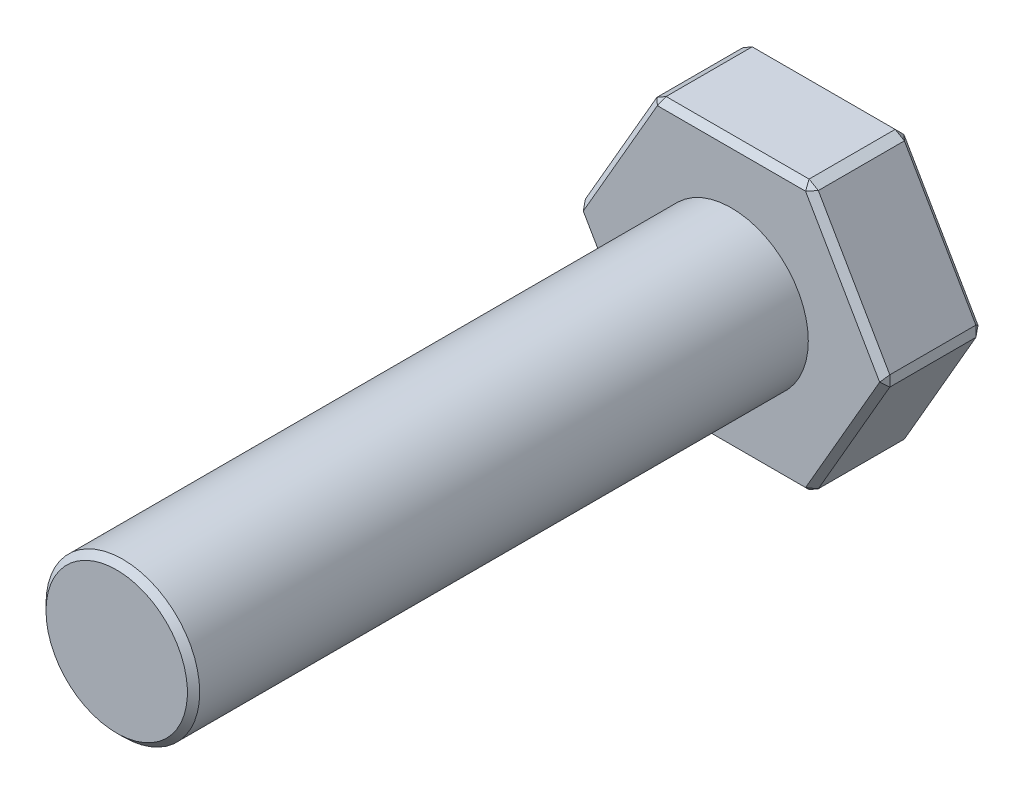
ISO-10303-21;
HEADER;
FILE_DESCRIPTION(('STEP AP214'),'2;1');
FILE_NAME('part.step','',(''),(''),'','','');
FILE_SCHEMA(('AUTOMOTIVE_DESIGN { 1 0 10303 214 1 1 1 1 }'));
ENDSEC;
DATA;
#1=APPLICATION_CONTEXT('core data for automotive mechanical design processes');
#2=APPLICATION_PROTOCOL_DEFINITION('international standard','automotive_design',2000,#1);
#3=PRODUCT_CONTEXT('',#1,'mechanical');
#4=PRODUCT('Part','Part','',(#3));
#5=PRODUCT_RELATED_PRODUCT_CATEGORY('part','',(#4));
#6=PRODUCT_DEFINITION_FORMATION('','',#4);
#7=PRODUCT_DEFINITION_CONTEXT('part definition',#1,'design');
#8=PRODUCT_DEFINITION('design','',#6,#7);
#9=PRODUCT_DEFINITION_SHAPE('','',#8);
#10=(LENGTH_UNIT() NAMED_UNIT(*) SI_UNIT(.MILLI.,.METRE.));
#11=(NAMED_UNIT(*) PLANE_ANGLE_UNIT() SI_UNIT($,.RADIAN.));
#12=(NAMED_UNIT(*) SI_UNIT($,.STERADIAN.) SOLID_ANGLE_UNIT());
#13=UNCERTAINTY_MEASURE_WITH_UNIT(LENGTH_MEASURE(1.E-05),#10,'distance_accuracy_value','');
#14=(GEOMETRIC_REPRESENTATION_CONTEXT(3) GLOBAL_UNCERTAINTY_ASSIGNED_CONTEXT((#13)) GLOBAL_UNIT_ASSIGNED_CONTEXT((#10,
#11,#12)) REPRESENTATION_CONTEXT('',''));
#15=CARTESIAN_POINT('',(0.,0.,0.));
#16=DIRECTION('',(0.,0.,1.));
#17=DIRECTION('',(1.,0.,0.));
#18=AXIS2_PLACEMENT_3D('',#15,#16,#17);
#19=CARTESIAN_POINT('',(-3.33490243318485,-5.33627954743875,0.254));
#20=DIRECTION('',(-0.418321028566615,-0.724553275351851,-0.547750005235851));
#21=DIRECTION('',(0.,0.603050160746813,-0.797703267903073));
#22=AXIS2_PLACEMENT_3D('',#19,#20,#21);
#23=PLANE('',#22);
#24=DIRECTION('',(0.729902592366238,0.0907675134870601,-0.677497944020808));
#25=VECTOR('',#24,1.);
#26=CARTESIAN_POINT('',(-3.33490243318485,-5.33627954743875,0.254000000000003));
#27=LINE('',#26,#25);
#28=CARTESIAN_POINT('',(-3.33490243318485,-5.33627954743875,0.254));
#29=VERTEX_POINT('',#28);
#30=CARTESIAN_POINT('',(-3.06125546481069,-5.30225,0.));
#31=VERTEX_POINT('',#30);
#32=EDGE_CURVE('E173',#29,#31,#27,.T.);
#33=ORIENTED_EDGE('',*,*,#32,.T.);
#34=DIRECTION('',(0.286344323664989,-0.677497944020808,0.677497944020805));
#35=VECTOR('',#34,1.);
#36=CARTESIAN_POINT('',(-3.06125546481069,-5.30225,0.));
#37=LINE('',#36,#35);
#38=CARTESIAN_POINT('',(-2.95390243318485,-5.55625,0.254));
#39=VERTEX_POINT('',#38);
#40=EDGE_CURVE('E171',#31,#39,#37,.T.);
#41=ORIENTED_EDGE('',*,*,#40,.T.);
#42=DIRECTION('',(-0.866025403784439,0.5,0.));
#43=VECTOR('',#42,1.);
#44=CARTESIAN_POINT('',(-2.95390243318485,-5.55625,0.253999999999998));
#45=LINE('',#44,#43);
#46=EDGE_CURVE('E184',#39,#29,#45,.T.);
#47=ORIENTED_EDGE('',*,*,#46,.T.);
#48=EDGE_LOOP('',(#33,#41,#47));
#49=FACE_BOUND('',#48,.T.);
#50=ADVANCED_FACE('F16',(#49),#23,.T.);
#51=CARTESIAN_POINT('',(-6.28880486636971,0.219970452561246,0.254000000000001));
#52=DIRECTION('',(-0.836642057133233,0.,-0.547750005235848));
#53=DIRECTION('',(-0.547750005235848,0.,0.836642057133233));
#54=AXIS2_PLACEMENT_3D('',#51,#52,#53);
#55=PLANE('',#54);
#56=DIRECTION('',(-0.443558268701259,-0.58673043053375,0.677497944020809));
#57=VECTOR('',#56,1.);
#58=CARTESIAN_POINT('',(-6.12251092962138,0.,0.));
#59=LINE('',#58,#57);
#60=CARTESIAN_POINT('',(-6.12251092962138,0.,0.));
#61=VERTEX_POINT('',#60);
#62=CARTESIAN_POINT('',(-6.28880486636971,-0.21997045256125,0.254));
#63=VERTEX_POINT('',#62);
#64=EDGE_CURVE('E180',#61,#63,#59,.T.);
#65=ORIENTED_EDGE('',*,*,#64,.T.);
#66=DIRECTION('',(0.,1.,0.));
#67=VECTOR('',#66,1.);
#68=CARTESIAN_POINT('',(-6.28880486636971,-0.21997045256125,0.254));
#69=LINE('',#68,#67);
#70=CARTESIAN_POINT('',(-6.28880486636971,0.219970452561246,0.254000000000001));
#71=VERTEX_POINT('',#70);
#72=EDGE_CURVE('E193',#63,#71,#69,.T.);
#73=ORIENTED_EDGE('',*,*,#72,.T.);
#74=DIRECTION('',(0.44355826870126,-0.586730430533748,-0.677497944020809));
#75=VECTOR('',#74,1.);
#76=CARTESIAN_POINT('',(-6.28880486636971,0.219970452561245,0.254000000000002));
#77=LINE('',#76,#75);
#78=EDGE_CURVE('E190',#71,#61,#77,.T.);
#79=ORIENTED_EDGE('',*,*,#78,.T.);
#80=EDGE_LOOP('',(#65,#73,#79));
#81=FACE_BOUND('',#80,.T.);
#82=ADVANCED_FACE('F514',(#81),#55,.T.);
#83=CARTESIAN_POINT('',(-2.95390243318485,5.55625,0.254));
#84=DIRECTION('',(-0.418321028566617,0.724553275351849,-0.547750005235851));
#85=DIRECTION('',(0.,0.603050160746814,0.797703267903073));
#86=AXIS2_PLACEMENT_3D('',#83,#84,#85);
#87=PLANE('',#86);
#88=DIRECTION('',(-0.729902592366236,0.0907675134870601,0.67749794402081));
#89=VECTOR('',#88,1.);
#90=CARTESIAN_POINT('',(-3.06125546481069,5.30225,0.));
#91=LINE('',#90,#89);
#92=CARTESIAN_POINT('',(-3.06125546481069,5.30225,0.));
#93=VERTEX_POINT('',#92);
#94=CARTESIAN_POINT('',(-3.33490243318485,5.33627954743875,0.254));
#95=VERTEX_POINT('',#94);
#96=EDGE_CURVE('E188',#93,#95,#91,.T.);
#97=ORIENTED_EDGE('',*,*,#96,.T.);
#98=DIRECTION('',(0.866025403784438,0.5,0.));
#99=VECTOR('',#98,1.);
#100=CARTESIAN_POINT('',(-3.33490243318485,5.33627954743875,0.254000000000001));
#101=LINE('',#100,#99);
#102=CARTESIAN_POINT('',(-2.95390243318485,5.55625,0.253999999999999));
#103=VERTEX_POINT('',#102);
#104=EDGE_CURVE('E202',#95,#103,#101,.T.);
#105=ORIENTED_EDGE('',*,*,#104,.T.);
#106=DIRECTION('',(-0.286344323664989,-0.677497944020806,-0.677497944020807));
#107=VECTOR('',#106,1.);
#108=CARTESIAN_POINT('',(-2.95390243318485,5.55625,0.254));
#109=LINE('',#108,#107);
#110=EDGE_CURVE('E199',#103,#93,#109,.T.);
#111=ORIENTED_EDGE('',*,*,#110,.T.);
#112=EDGE_LOOP('',(#97,#105,#111));
#113=FACE_BOUND('',#112,.T.);
#114=ADVANCED_FACE('F511',(#113),#87,.T.);
#115=CARTESIAN_POINT('',(3.0612554648107,5.30224999999999,0.));
#116=DIRECTION('',(0.418321028566615,0.724553275351851,-0.54775000523585));
#117=DIRECTION('',(0.,0.603050160746813,0.797703267903074));
#118=AXIS2_PLACEMENT_3D('',#115,#116,#117);
#119=PLANE('',#118);
#120=DIRECTION('',(-0.286344323664964,0.677497944020812,0.677497944020812));
#121=VECTOR('',#120,1.);
#122=CARTESIAN_POINT('',(3.0612554648107,5.30224999999999,0.));
#123=LINE('',#122,#121);
#124=CARTESIAN_POINT('',(3.0612554648107,5.30224999999999,0.));
#125=VERTEX_POINT('',#124);
#126=CARTESIAN_POINT('',(2.95390243318487,5.55624999999999,0.254));
#127=VERTEX_POINT('',#126);
#128=EDGE_CURVE('E197',#125,#127,#123,.T.);
#129=ORIENTED_EDGE('',*,*,#128,.T.);
#130=DIRECTION('',(0.866025403784439,-0.5,0.));
#131=VECTOR('',#130,1.);
#132=CARTESIAN_POINT('',(2.95390243318487,5.55624999999999,0.253999999999998));
#133=LINE('',#132,#131);
#134=CARTESIAN_POINT('',(3.33490243318487,5.33627954743874,0.253999999999999));
#135=VERTEX_POINT('',#134);
#136=EDGE_CURVE('E210',#127,#135,#133,.T.);
#137=ORIENTED_EDGE('',*,*,#136,.T.);
#138=DIRECTION('',(-0.729902592366239,-0.0907675134870516,-0.677497944020808));
#139=VECTOR('',#138,1.);
#140=CARTESIAN_POINT('',(3.33490243318487,5.33627954743874,0.253999999999998));
#141=LINE('',#140,#139);
#142=EDGE_CURVE('E204',#135,#125,#141,.T.);
#143=ORIENTED_EDGE('',*,*,#142,.T.);
#144=EDGE_LOOP('',(#129,#137,#143));
#145=FACE_BOUND('',#144,.T.);
#146=ADVANCED_FACE('F508',(#145),#119,.T.);
#147=CARTESIAN_POINT('',(-3.20790243318485,5.55625,0.));
#148=DIRECTION('',(0.,0.,-1.));
#149=DIRECTION('',(-1.,0.,0.));
#150=AXIS2_PLACEMENT_3D('',#147,#148,#149);
#151=PLANE('',#150);
#152=DIRECTION('',(1.,0.,0.));
#153=VECTOR('',#152,1.);
#154=CARTESIAN_POINT('',(-3.20790243318486,-5.30225000000001,0.));
#155=LINE('',#154,#153);
#156=CARTESIAN_POINT('',(3.0612554648107,-5.30225000000001,0.));
#157=VERTEX_POINT('',#156);
#158=EDGE_CURVE('E137',#157,#31,#155,.F.);
#159=ORIENTED_EDGE('',*,*,#158,.T.);
#160=DIRECTION('',(-0.5,0.866025403784439,0.));
#161=VECTOR('',#160,1.);
#162=CARTESIAN_POINT('',(-3.06125546481068,-5.30225,0.));
#163=LINE('',#162,#161);
#164=EDGE_CURVE('E178',#31,#61,#163,.T.);
#165=ORIENTED_EDGE('',*,*,#164,.T.);
#166=DIRECTION('',(0.5,0.866025403784439,0.));
#167=VECTOR('',#166,1.);
#168=CARTESIAN_POINT('',(-6.12251092962138,0.,0.));
#169=LINE('',#168,#167);
#170=EDGE_CURVE('E186',#61,#93,#169,.T.);
#171=ORIENTED_EDGE('',*,*,#170,.T.);
#172=DIRECTION('',(1.,0.,0.));
#173=VECTOR('',#172,1.);
#174=CARTESIAN_POINT('',(-3.20790243318485,5.30225,0.));
#175=LINE('',#174,#173);
#176=EDGE_CURVE('E195',#93,#125,#175,.T.);
#177=ORIENTED_EDGE('',*,*,#176,.T.);
#178=DIRECTION('',(0.5,-0.866025403784439,0.));
#179=VECTOR('',#178,1.);
#180=CARTESIAN_POINT('',(3.0612554648107,5.30224999999999,0.));
#181=LINE('',#180,#179);
#182=CARTESIAN_POINT('',(6.12251092962139,0.,0.));
#183=VERTEX_POINT('',#182);
#184=EDGE_CURVE('E166',#125,#183,#181,.T.);
#185=ORIENTED_EDGE('',*,*,#184,.T.);
#186=DIRECTION('',(-0.499999999999999,-0.866025403784439,0.));
#187=VECTOR('',#186,1.);
#188=CARTESIAN_POINT('',(6.12251092962139,0.,0.));
#189=LINE('',#188,#187);
#190=EDGE_CURVE('E157',#183,#157,#189,.T.);
#191=ORIENTED_EDGE('',*,*,#190,.T.);
#192=EDGE_LOOP('',(#159,#165,#171,#177,#185,#191));
#193=FACE_BOUND('',#192,.T.);
#194=ADVANCED_FACE('F164',(#193),#151,.T.);
#195=CARTESIAN_POINT('',(2.95390243318487,-5.55625000000001,0.254));
#196=DIRECTION('',(0.418321028566616,-0.72455327535185,-0.547750005235851));
#197=DIRECTION('',(0.,0.603050160746814,-0.797703267903073));
#198=AXIS2_PLACEMENT_3D('',#195,#196,#197);
#199=PLANE('',#198);
#200=DIRECTION('',(0.286344323664968,0.677497944020813,-0.67749794402081));
#201=VECTOR('',#200,1.);
#202=CARTESIAN_POINT('',(2.95390243318487,-5.55625000000001,0.254000000000002));
#203=LINE('',#202,#201);
#204=CARTESIAN_POINT('',(2.95390243318487,-5.55625000000001,0.253999999999999));
#205=VERTEX_POINT('',#204);
#206=EDGE_CURVE('E142',#205,#157,#203,.T.);
#207=ORIENTED_EDGE('',*,*,#206,.T.);
#208=DIRECTION('',(0.729902592366236,-0.0907675134870579,0.67749794402081));
#209=VECTOR('',#208,1.);
#210=CARTESIAN_POINT('',(3.0612554648107,-5.30225000000001,0.));
#211=LINE('',#210,#209);
#212=CARTESIAN_POINT('',(3.33490243318486,-5.33627954743876,0.253999999999998));
#213=VERTEX_POINT('',#212);
#214=EDGE_CURVE('E145',#157,#213,#211,.T.);
#215=ORIENTED_EDGE('',*,*,#214,.T.);
#216=DIRECTION('',(-0.866025403784439,-0.5,0.));
#217=VECTOR('',#216,1.);
#218=CARTESIAN_POINT('',(3.33490243318486,-5.33627954743876,0.253999999999998));
#219=LINE('',#218,#217);
#220=EDGE_CURVE('E147',#213,#205,#219,.T.);
#221=ORIENTED_EDGE('',*,*,#220,.T.);
#222=EDGE_LOOP('',(#207,#215,#221));
#223=FACE_BOUND('',#222,.T.);
#224=ADVANCED_FACE('F144',(#223),#199,.T.);
#225=CARTESIAN_POINT('',(6.12251092962139,0.,0.));
#226=DIRECTION('',(0.836642057133232,0.,-0.547750005235849));
#227=DIRECTION('',(-0.547750005235849,0.,-0.836642057133232));
#228=AXIS2_PLACEMENT_3D('',#225,#226,#227);
#229=PLANE('',#228);
#230=DIRECTION('',(0.443558268701263,0.586730430533746,0.67749794402081));
#231=VECTOR('',#230,1.);
#232=CARTESIAN_POINT('',(6.12251092962139,0.,0.));
#233=LINE('',#232,#231);
#234=CARTESIAN_POINT('',(6.28880486636972,0.219970452561248,0.254));
#235=VERTEX_POINT('',#234);
#236=EDGE_CURVE('E208',#183,#235,#233,.T.);
#237=ORIENTED_EDGE('',*,*,#236,.T.);
#238=DIRECTION('',(0.,-1.,0.));
#239=VECTOR('',#238,1.);
#240=CARTESIAN_POINT('',(6.28880486636972,0.219970452561247,0.254));
#241=LINE('',#240,#239);
#242=CARTESIAN_POINT('',(6.28880486636972,-0.219970452561249,0.253999999999999));
#243=VERTEX_POINT('',#242);
#244=EDGE_CURVE('E215',#235,#243,#241,.T.);
#245=ORIENTED_EDGE('',*,*,#244,.T.);
#246=DIRECTION('',(-0.443558268701261,0.586730430533747,-0.67749794402081));
#247=VECTOR('',#246,1.);
#248=CARTESIAN_POINT('',(6.28880486636972,-0.219970452561249,0.253999999999997));
#249=LINE('',#248,#247);
#250=EDGE_CURVE('E167',#243,#183,#249,.T.);
#251=ORIENTED_EDGE('',*,*,#250,.T.);
#252=EDGE_LOOP('',(#237,#245,#251));
#253=FACE_BOUND('',#252,.T.);
#254=ADVANCED_FACE('F500',(#253),#229,.T.);
#255=CARTESIAN_POINT('',(-3.20790243318486,-5.30225,0.));
#256=DIRECTION('',(0.,0.707106781186546,0.707106781186549));
#257=DIRECTION('',(0.,-0.707106781186549,0.707106781186546));
#258=AXIS2_PLACEMENT_3D('',#255,#256,#257);
#259=PLANE('',#258);
#260=ORIENTED_EDGE('',*,*,#158,.F.);
#261=ORIENTED_EDGE('',*,*,#206,.F.);
#262=DIRECTION('',(1.,0.,0.));
#263=VECTOR('',#262,1.);
#264=CARTESIAN_POINT('',(3.20790243318487,-5.55625000000001,0.254));
#265=LINE('',#264,#263);
#266=EDGE_CURVE('E220',#39,#205,#265,.T.);
#267=ORIENTED_EDGE('',*,*,#266,.F.);
#268=ORIENTED_EDGE('',*,*,#40,.F.);
#269=EDGE_LOOP('',(#260,#261,#267,#268));
#270=FACE_BOUND('',#269,.T.);
#271=ADVANCED_FACE('F170',(#270),#259,.F.);
#272=CARTESIAN_POINT('',(-7.79978563040089,2.905125,0.));
#273=DIRECTION('',(0.612372435695794,0.353553390593274,0.707106781186548));
#274=DIRECTION('',(0.755928946018455,0.,-0.654653670707977));
#275=AXIS2_PLACEMENT_3D('',#272,#273,#274);
#276=PLANE('',#275);
#277=ORIENTED_EDGE('',*,*,#164,.F.);
#278=ORIENTED_EDGE('',*,*,#32,.F.);
#279=DIRECTION('',(0.5,-0.866025403784439,0.));
#280=VECTOR('',#279,1.);
#281=CARTESIAN_POINT('',(-3.20790243318485,-5.55625,0.253999999999998));
#282=LINE('',#281,#280);
#283=EDGE_CURVE('E229',#63,#29,#282,.T.);
#284=ORIENTED_EDGE('',*,*,#283,.F.);
#285=ORIENTED_EDGE('',*,*,#64,.F.);
#286=EDGE_LOOP('',(#277,#278,#284,#285));
#287=FACE_BOUND('',#286,.T.);
#288=ADVANCED_FACE('F493',(#287),#276,.F.);
#289=CARTESIAN_POINT('',(-2.95390243318485,-5.55625,4.064));
#290=DIRECTION('',(0.5,0.866025403784439,0.));
#291=DIRECTION('',(-0.866025403784439,0.5,0.));
#292=AXIS2_PLACEMENT_3D('',#289,#290,#291);
#293=PLANE('',#292);
#294=DIRECTION('',(0.,0.,1.));
#295=VECTOR('',#294,1.);
#296=CARTESIAN_POINT('',(-2.95390243318485,-5.55625,4.064));
#297=LINE('',#296,#295);
#298=CARTESIAN_POINT('',(-2.95390243318485,-5.55625,3.81));
#299=VERTEX_POINT('',#298);
#300=EDGE_CURVE('E217',#299,#39,#297,.F.);
#301=ORIENTED_EDGE('',*,*,#300,.F.);
#302=DIRECTION('',(-0.866025403784439,0.5,0.));
#303=VECTOR('',#302,1.);
#304=CARTESIAN_POINT('',(-2.95390243318485,-5.55625,3.81));
#305=LINE('',#304,#303);
#306=CARTESIAN_POINT('',(-3.33490243318485,-5.33627954743875,3.81));
#307=VERTEX_POINT('',#306);
#308=EDGE_CURVE('E182',#307,#299,#305,.F.);
#309=ORIENTED_EDGE('',*,*,#308,.F.);
#310=DIRECTION('',(0.,0.,1.));
#311=VECTOR('',#310,1.);
#312=CARTESIAN_POINT('',(-3.33490243318485,-5.33627954743875,4.064));
#313=LINE('',#312,#311);
#314=EDGE_CURVE('E232',#29,#307,#313,.T.);
#315=ORIENTED_EDGE('',*,*,#314,.F.);
#316=ORIENTED_EDGE('',*,*,#46,.F.);
#317=EDGE_LOOP('',(#301,#309,#315,#316));
#318=FACE_BOUND('',#317,.T.);
#319=ADVANCED_FACE('F489',(#318),#293,.F.);
#320=CARTESIAN_POINT('',(-2.9879319806236,5.42925,0.));
#321=DIRECTION('',(0.612372435695795,-0.353553390593274,0.707106781186547));
#322=DIRECTION('',(0.755928946018454,0.,-0.654653670707978));
#323=AXIS2_PLACEMENT_3D('',#320,#321,#322);
#324=PLANE('',#323);
#325=DIRECTION('',(-0.5,-0.866025403784439,0.));
#326=VECTOR('',#325,1.);
#327=CARTESIAN_POINT('',(-6.41580486636971,0.,0.253999999999999));
#328=LINE('',#327,#326);
#329=EDGE_CURVE('E241',#95,#71,#328,.T.);
#330=ORIENTED_EDGE('',*,*,#329,.F.);
#331=ORIENTED_EDGE('',*,*,#96,.F.);
#332=ORIENTED_EDGE('',*,*,#170,.F.);
#333=ORIENTED_EDGE('',*,*,#78,.F.);
#334=EDGE_LOOP('',(#330,#331,#332,#333));
#335=FACE_BOUND('',#334,.T.);
#336=ADVANCED_FACE('F486',(#335),#324,.F.);
#337=CARTESIAN_POINT('',(-6.28880486636971,-0.21997045256125,4.064));
#338=DIRECTION('',(1.,0.,0.));
#339=DIRECTION('',(0.,0.,-1.));
#340=AXIS2_PLACEMENT_3D('',#337,#338,#339);
#341=PLANE('',#340);
#342=DIRECTION('',(0.,0.,1.));
#343=VECTOR('',#342,1.);
#344=CARTESIAN_POINT('',(-6.28880486636971,-0.219970452561247,4.064));
#345=LINE('',#344,#343);
#346=CARTESIAN_POINT('',(-6.28880486636971,-0.21997045256125,3.81));
#347=VERTEX_POINT('',#346);
#348=EDGE_CURVE('E226',#347,#63,#345,.F.);
#349=ORIENTED_EDGE('',*,*,#348,.F.);
#350=DIRECTION('',(0.,1.,0.));
#351=VECTOR('',#350,1.);
#352=CARTESIAN_POINT('',(-6.28880486636971,0.,3.81));
#353=LINE('',#352,#351);
#354=CARTESIAN_POINT('',(-6.28880486636971,0.219970452561246,3.81));
#355=VERTEX_POINT('',#354);
#356=EDGE_CURVE('E235',#355,#347,#353,.F.);
#357=ORIENTED_EDGE('',*,*,#356,.F.);
#358=DIRECTION('',(0.,0.,1.));
#359=VECTOR('',#358,1.);
#360=CARTESIAN_POINT('',(-6.28880486636971,0.219970452561246,4.064));
#361=LINE('',#360,#359);
#362=EDGE_CURVE('E244',#71,#355,#361,.T.);
#363=ORIENTED_EDGE('',*,*,#362,.F.);
#364=ORIENTED_EDGE('',*,*,#72,.F.);
#365=EDGE_LOOP('',(#349,#357,#363,#364));
#366=FACE_BOUND('',#365,.T.);
#367=ADVANCED_FACE('F437',(#366),#341,.F.);
#368=CARTESIAN_POINT('',(-3.20790243318485,5.30225,0.));
#369=DIRECTION('',(0.,-0.707106781186548,0.707106781186548));
#370=DIRECTION('',(0.,-0.707106781186548,-0.707106781186548));
#371=AXIS2_PLACEMENT_3D('',#368,#369,#370);
#372=PLANE('',#371);
#373=DIRECTION('',(-1.,0.,0.));
#374=VECTOR('',#373,1.);
#375=CARTESIAN_POINT('',(-3.20790243318485,5.55625,0.254));
#376=LINE('',#375,#374);
#377=EDGE_CURVE('E253',#127,#103,#376,.T.);
#378=ORIENTED_EDGE('',*,*,#377,.F.);
#379=ORIENTED_EDGE('',*,*,#128,.F.);
#380=ORIENTED_EDGE('',*,*,#176,.F.);
#381=ORIENTED_EDGE('',*,*,#110,.F.);
#382=EDGE_LOOP('',(#378,#379,#380,#381));
#383=FACE_BOUND('',#382,.T.);
#384=ADVANCED_FACE('F480',(#383),#372,.F.);
#385=CARTESIAN_POINT('',(-3.33490243318485,5.33627954743875,4.064));
#386=DIRECTION('',(0.5,-0.866025403784438,0.));
#387=DIRECTION('',(0.866025403784438,0.5,0.));
#388=AXIS2_PLACEMENT_3D('',#385,#386,#387);
#389=PLANE('',#388);
#390=DIRECTION('',(0.,0.,1.));
#391=VECTOR('',#390,1.);
#392=CARTESIAN_POINT('',(-3.33490243318485,5.33627954743875,4.064));
#393=LINE('',#392,#391);
#394=CARTESIAN_POINT('',(-3.33490243318485,5.33627954743875,3.81));
#395=VERTEX_POINT('',#394);
#396=EDGE_CURVE('E238',#395,#95,#393,.F.);
#397=ORIENTED_EDGE('',*,*,#396,.F.);
#398=DIRECTION('',(-0.866025403784438,-0.500000000000002,0.));
#399=VECTOR('',#398,1.);
#400=CARTESIAN_POINT('',(-2.95390243318485,5.55625,3.81));
#401=LINE('',#400,#399);
#402=CARTESIAN_POINT('',(-2.95390243318485,5.55625,3.81));
#403=VERTEX_POINT('',#402);
#404=EDGE_CURVE('E247',#403,#395,#401,.T.);
#405=ORIENTED_EDGE('',*,*,#404,.F.);
#406=DIRECTION('',(0.,0.,1.));
#407=VECTOR('',#406,1.);
#408=CARTESIAN_POINT('',(-2.95390243318485,5.55625,4.064));
#409=LINE('',#408,#407);
#410=EDGE_CURVE('E256',#103,#403,#409,.T.);
#411=ORIENTED_EDGE('',*,*,#410,.F.);
#412=ORIENTED_EDGE('',*,*,#104,.F.);
#413=EDGE_LOOP('',(#397,#405,#411,#412));
#414=FACE_BOUND('',#413,.T.);
#415=ADVANCED_FACE('F430',(#414),#389,.F.);
#416=CARTESIAN_POINT('',(1.38398076403119,8.207375,0.));
#417=DIRECTION('',(-0.612372435695795,-0.353553390593274,0.707106781186547));
#418=DIRECTION('',(0.755928946018454,0.,0.654653670707978));
#419=AXIS2_PLACEMENT_3D('',#416,#417,#418);
#420=PLANE('',#419);
#421=ORIENTED_EDGE('',*,*,#184,.F.);
#422=ORIENTED_EDGE('',*,*,#142,.F.);
#423=DIRECTION('',(-0.5,0.866025403784439,0.));
#424=VECTOR('',#423,1.);
#425=CARTESIAN_POINT('',(3.20790243318487,5.55624999999999,0.253999999999998));
#426=LINE('',#425,#424);
#427=EDGE_CURVE('E262',#235,#135,#426,.T.);
#428=ORIENTED_EDGE('',*,*,#427,.F.);
#429=ORIENTED_EDGE('',*,*,#236,.F.);
#430=EDGE_LOOP('',(#421,#422,#428,#429));
#431=FACE_BOUND('',#430,.T.);
#432=ADVANCED_FACE('F473',(#431),#420,.F.);
#433=CARTESIAN_POINT('',(2.95390243318487,5.55624999999999,4.064));
#434=DIRECTION('',(-0.5,-0.866025403784439,0.));
#435=DIRECTION('',(0.866025403784439,-0.5,0.));
#436=AXIS2_PLACEMENT_3D('',#433,#434,#435);
#437=PLANE('',#436);
#438=DIRECTION('',(0.,0.,1.));
#439=VECTOR('',#438,1.);
#440=CARTESIAN_POINT('',(2.95390243318487,5.55624999999999,4.064));
#441=LINE('',#440,#439);
#442=CARTESIAN_POINT('',(2.95390243318487,5.55624999999999,3.81));
#443=VERTEX_POINT('',#442);
#444=EDGE_CURVE('E250',#443,#127,#441,.F.);
#445=ORIENTED_EDGE('',*,*,#444,.F.);
#446=DIRECTION('',(-0.866025403784437,0.500000000000002,0.));
#447=VECTOR('',#446,1.);
#448=CARTESIAN_POINT('',(3.33490243318487,5.33627954743874,3.81));
#449=LINE('',#448,#447);
#450=CARTESIAN_POINT('',(3.33490243318487,5.33627954743874,3.81));
#451=VERTEX_POINT('',#450);
#452=EDGE_CURVE('E259',#451,#443,#449,.T.);
#453=ORIENTED_EDGE('',*,*,#452,.F.);
#454=DIRECTION('',(0.,0.,1.));
#455=VECTOR('',#454,1.);
#456=CARTESIAN_POINT('',(3.33490243318487,5.33627954743874,4.064));
#457=LINE('',#456,#455);
#458=EDGE_CURVE('E265',#135,#451,#457,.T.);
#459=ORIENTED_EDGE('',*,*,#458,.F.);
#460=ORIENTED_EDGE('',*,*,#136,.F.);
#461=EDGE_LOOP('',(#445,#453,#459,#460));
#462=FACE_BOUND('',#461,.T.);
#463=ADVANCED_FACE('F469',(#462),#437,.F.);
#464=CARTESIAN_POINT('',(3.33490243318486,-5.33627954743876,4.064));
#465=DIRECTION('',(-0.5,0.866025403784439,0.));
#466=DIRECTION('',(-0.866025403784439,-0.5,0.));
#467=AXIS2_PLACEMENT_3D('',#464,#465,#466);
#468=PLANE('',#467);
#469=DIRECTION('',(0.,0.,1.));
#470=VECTOR('',#469,1.);
#471=CARTESIAN_POINT('',(3.33490243318486,-5.33627954743876,4.064));
#472=LINE('',#471,#470);
#473=CARTESIAN_POINT('',(3.33490243318486,-5.33627954743876,3.81));
#474=VERTEX_POINT('',#473);
#475=EDGE_CURVE('E274',#474,#213,#472,.F.);
#476=ORIENTED_EDGE('',*,*,#475,.F.);
#477=DIRECTION('',(0.866025403784436,0.500000000000005,0.));
#478=VECTOR('',#477,1.);
#479=CARTESIAN_POINT('',(2.95390243318487,-5.55625000000001,3.81));
#480=LINE('',#479,#478);
#481=CARTESIAN_POINT('',(2.95390243318487,-5.55625000000001,3.81));
#482=VERTEX_POINT('',#481);
#483=EDGE_CURVE('E271',#482,#474,#480,.T.);
#484=ORIENTED_EDGE('',*,*,#483,.F.);
#485=DIRECTION('',(0.,0.,1.));
#486=VECTOR('',#485,1.);
#487=CARTESIAN_POINT('',(2.95390243318487,-5.55625000000001,4.064));
#488=LINE('',#487,#486);
#489=EDGE_CURVE('E223',#205,#482,#488,.T.);
#490=ORIENTED_EDGE('',*,*,#489,.F.);
#491=ORIENTED_EDGE('',*,*,#220,.F.);
#492=EDGE_LOOP('',(#476,#484,#490,#491));
#493=FACE_BOUND('',#492,.T.);
#494=ADVANCED_FACE('F466',(#493),#468,.F.);
#495=CARTESIAN_POINT('',(6.19583441380848,0.127000000000001,0.));
#496=DIRECTION('',(-0.612372435695795,0.353553390593274,0.707106781186547));
#497=DIRECTION('',(0.755928946018454,0.,0.654653670707978));
#498=AXIS2_PLACEMENT_3D('',#495,#496,#497);
#499=PLANE('',#498);
#500=ORIENTED_EDGE('',*,*,#190,.F.);
#501=ORIENTED_EDGE('',*,*,#250,.F.);
#502=DIRECTION('',(0.5,0.866025403784439,0.));
#503=VECTOR('',#502,1.);
#504=CARTESIAN_POINT('',(6.41580486636972,0.,0.253999999999998));
#505=LINE('',#504,#503);
#506=EDGE_CURVE('E160',#213,#243,#505,.T.);
#507=ORIENTED_EDGE('',*,*,#506,.F.);
#508=ORIENTED_EDGE('',*,*,#214,.F.);
#509=EDGE_LOOP('',(#500,#501,#507,#508));
#510=FACE_BOUND('',#509,.T.);
#511=ADVANCED_FACE('F155',(#510),#499,.F.);
#512=CARTESIAN_POINT('',(6.28880486636972,0.219970452561247,4.064));
#513=DIRECTION('',(-1.,0.,0.));
#514=DIRECTION('',(0.,-1.,0.));
#515=AXIS2_PLACEMENT_3D('',#512,#513,#514);
#516=PLANE('',#515);
#517=DIRECTION('',(0.,0.,1.));
#518=VECTOR('',#517,1.);
#519=CARTESIAN_POINT('',(6.28880486636972,0.219970452561248,4.064));
#520=LINE('',#519,#518);
#521=CARTESIAN_POINT('',(6.28880486636972,0.219970452561248,3.81));
#522=VERTEX_POINT('',#521);
#523=EDGE_CURVE('E268',#522,#235,#520,.F.);
#524=ORIENTED_EDGE('',*,*,#523,.F.);
#525=DIRECTION('',(0.,-1.,0.));
#526=VECTOR('',#525,1.);
#527=CARTESIAN_POINT('',(6.28880486636972,0.219970452561247,3.81));
#528=LINE('',#527,#526);
#529=CARTESIAN_POINT('',(6.28880486636972,-0.219970452561248,3.81));
#530=VERTEX_POINT('',#529);
#531=EDGE_CURVE('E162',#530,#522,#528,.F.);
#532=ORIENTED_EDGE('',*,*,#531,.F.);
#533=DIRECTION('',(0.,0.,1.));
#534=VECTOR('',#533,1.);
#535=CARTESIAN_POINT('',(6.28880486636972,-0.219970452561248,4.064));
#536=LINE('',#535,#534);
#537=EDGE_CURVE('E277',#243,#530,#536,.T.);
#538=ORIENTED_EDGE('',*,*,#537,.F.);
#539=ORIENTED_EDGE('',*,*,#244,.F.);
#540=EDGE_LOOP('',(#524,#532,#538,#539));
#541=FACE_BOUND('',#540,.T.);
#542=ADVANCED_FACE('F459',(#541),#516,.F.);
#543=CARTESIAN_POINT('',(3.20790243318487,-5.55625000000001,4.064));
#544=DIRECTION('',(0.,-1.,0.));
#545=DIRECTION('',(1.,0.,0.));
#546=AXIS2_PLACEMENT_3D('',#543,#544,#545);
#547=PLANE('',#546);
#548=ORIENTED_EDGE('',*,*,#266,.T.);
#549=ORIENTED_EDGE('',*,*,#489,.T.);
#550=DIRECTION('',(1.,0.,0.));
#551=VECTOR('',#550,1.);
#552=CARTESIAN_POINT('',(3.20790243318487,-5.55625000000001,3.81));
#553=LINE('',#552,#551);
#554=EDGE_CURVE('E283',#299,#482,#553,.T.);
#555=ORIENTED_EDGE('',*,*,#554,.F.);
#556=ORIENTED_EDGE('',*,*,#300,.T.);
#557=EDGE_LOOP('',(#548,#549,#555,#556));
#558=FACE_BOUND('',#557,.T.);
#559=ADVANCED_FACE('F455',(#558),#547,.T.);
#560=CARTESIAN_POINT('',(-3.20790243318485,-5.55625,4.064));
#561=DIRECTION('',(-0.866025403784439,-0.5,0.));
#562=DIRECTION('',(0.5,-0.866025403784439,0.));
#563=AXIS2_PLACEMENT_3D('',#560,#561,#562);
#564=PLANE('',#563);
#565=ORIENTED_EDGE('',*,*,#283,.T.);
#566=ORIENTED_EDGE('',*,*,#314,.T.);
#567=DIRECTION('',(0.500000000000001,-0.866025403784438,0.));
#568=VECTOR('',#567,1.);
#569=CARTESIAN_POINT('',(-6.28880486636971,-0.219970452561248,3.81));
#570=LINE('',#569,#568);
#571=EDGE_CURVE('E292',#347,#307,#570,.T.);
#572=ORIENTED_EDGE('',*,*,#571,.F.);
#573=ORIENTED_EDGE('',*,*,#348,.T.);
#574=EDGE_LOOP('',(#565,#566,#572,#573));
#575=FACE_BOUND('',#574,.T.);
#576=ADVANCED_FACE('F449',(#575),#564,.T.);
#577=CARTESIAN_POINT('',(-3.06125546481069,-5.30225,4.064));
#578=DIRECTION('',(-0.418321028566615,-0.72455327535185,0.547750005235852));
#579=DIRECTION('',(0.,-0.603050160746815,-0.797703267903072));
#580=AXIS2_PLACEMENT_3D('',#577,#578,#579);
#581=PLANE('',#580);
#582=ORIENTED_EDGE('',*,*,#308,.T.);
#583=DIRECTION('',(0.286344323664989,-0.677497944020809,-0.677497944020804));
#584=VECTOR('',#583,1.);
#585=CARTESIAN_POINT('',(-3.06125546481069,-5.30225,4.064));
#586=LINE('',#585,#584);
#587=CARTESIAN_POINT('',(-3.06125546481069,-5.30225,4.064));
#588=VERTEX_POINT('',#587);
#589=EDGE_CURVE('E280',#588,#299,#586,.T.);
#590=ORIENTED_EDGE('',*,*,#589,.F.);
#591=DIRECTION('',(0.729902592366237,0.0907675134870602,0.677497944020809));
#592=VECTOR('',#591,1.);
#593=CARTESIAN_POINT('',(-3.33490243318485,-5.33627954743875,3.81));
#594=LINE('',#593,#592);
#595=EDGE_CURVE('E295',#307,#588,#594,.T.);
#596=ORIENTED_EDGE('',*,*,#595,.F.);
#597=EDGE_LOOP('',(#582,#590,#596));
#598=FACE_BOUND('',#597,.T.);
#599=ADVANCED_FACE('F442',(#598),#581,.T.);
#600=CARTESIAN_POINT('',(-6.12251092962138,0.,4.064));
#601=DIRECTION('',(-0.836642057133231,0.,0.547750005235851));
#602=DIRECTION('',(0.547750005235851,0.,0.836642057133231));
#603=AXIS2_PLACEMENT_3D('',#600,#601,#602);
#604=PLANE('',#603);
#605=DIRECTION('',(-0.443558268701258,-0.586730430533749,-0.67749794402081));
#606=VECTOR('',#605,1.);
#607=CARTESIAN_POINT('',(-6.12251092962138,0.,4.064));
#608=LINE('',#607,#606);
#609=CARTESIAN_POINT('',(-6.12251092962138,0.,4.064));
#610=VERTEX_POINT('',#609);
#611=EDGE_CURVE('E289',#610,#347,#608,.T.);
#612=ORIENTED_EDGE('',*,*,#611,.F.);
#613=DIRECTION('',(0.44355826870126,-0.586730430533748,0.67749794402081));
#614=VECTOR('',#613,1.);
#615=CARTESIAN_POINT('',(-6.28880486636971,0.219970452561246,3.81));
#616=LINE('',#615,#614);
#617=EDGE_CURVE('E298',#355,#610,#616,.T.);
#618=ORIENTED_EDGE('',*,*,#617,.F.);
#619=ORIENTED_EDGE('',*,*,#356,.T.);
#620=EDGE_LOOP('',(#612,#618,#619));
#621=FACE_BOUND('',#620,.T.);
#622=ADVANCED_FACE('F440',(#621),#604,.T.);
#623=CARTESIAN_POINT('',(-6.41580486636971,0.,4.064));
#624=DIRECTION('',(-0.866025403784439,0.5,0.));
#625=DIRECTION('',(-0.5,-0.866025403784439,0.));
#626=AXIS2_PLACEMENT_3D('',#623,#624,#625);
#627=PLANE('',#626);
#628=ORIENTED_EDGE('',*,*,#329,.T.);
#629=ORIENTED_EDGE('',*,*,#362,.T.);
#630=DIRECTION('',(-0.5,-0.866025403784438,0.));
#631=VECTOR('',#630,1.);
#632=CARTESIAN_POINT('',(-3.33490243318485,5.33627954743875,3.81));
#633=LINE('',#632,#631);
#634=EDGE_CURVE('E304',#395,#355,#633,.T.);
#635=ORIENTED_EDGE('',*,*,#634,.F.);
#636=ORIENTED_EDGE('',*,*,#396,.T.);
#637=EDGE_LOOP('',(#628,#629,#635,#636));
#638=FACE_BOUND('',#637,.T.);
#639=ADVANCED_FACE('F433',(#638),#627,.T.);
#640=CARTESIAN_POINT('',(-2.95390243318485,5.55625,3.81));
#641=DIRECTION('',(-0.418321028566616,0.724553275351849,0.547750005235852));
#642=DIRECTION('',(0.,-0.603050160746815,0.797703267903072));
#643=AXIS2_PLACEMENT_3D('',#640,#641,#642);
#644=PLANE('',#643);
#645=DIRECTION('',(-0.729902592366237,0.0907675134870603,-0.677497944020809));
#646=VECTOR('',#645,1.);
#647=CARTESIAN_POINT('',(-3.06125546481069,5.30225,4.064));
#648=LINE('',#647,#646);
#649=CARTESIAN_POINT('',(-3.06125546481069,5.30225,4.064));
#650=VERTEX_POINT('',#649);
#651=EDGE_CURVE('E301',#650,#395,#648,.T.);
#652=ORIENTED_EDGE('',*,*,#651,.F.);
#653=DIRECTION('',(-0.286344323664989,-0.677497944020807,0.677497944020807));
#654=VECTOR('',#653,1.);
#655=CARTESIAN_POINT('',(-2.95390243318485,5.55625,3.81));
#656=LINE('',#655,#654);
#657=EDGE_CURVE('E307',#403,#650,#656,.T.);
#658=ORIENTED_EDGE('',*,*,#657,.F.);
#659=ORIENTED_EDGE('',*,*,#404,.T.);
#660=EDGE_LOOP('',(#652,#658,#659));
#661=FACE_BOUND('',#660,.T.);
#662=ADVANCED_FACE('F422',(#661),#644,.T.);
#663=CARTESIAN_POINT('',(-3.20790243318485,5.55625,4.064));
#664=DIRECTION('',(0.,1.,0.));
#665=DIRECTION('',(-1.,0.,0.));
#666=AXIS2_PLACEMENT_3D('',#663,#664,#665);
#667=PLANE('',#666);
#668=ORIENTED_EDGE('',*,*,#410,.T.);
#669=DIRECTION('',(1.,0.,0.));
#670=VECTOR('',#669,1.);
#671=CARTESIAN_POINT('',(-3.20790243318485,5.55625,3.81000000000001));
#672=LINE('',#671,#670);
#673=EDGE_CURVE('E313',#443,#403,#672,.F.);
#674=ORIENTED_EDGE('',*,*,#673,.F.);
#675=ORIENTED_EDGE('',*,*,#444,.T.);
#676=ORIENTED_EDGE('',*,*,#377,.T.);
#677=EDGE_LOOP('',(#668,#674,#675,#676));
#678=FACE_BOUND('',#677,.T.);
#679=ADVANCED_FACE('F426',(#678),#667,.T.);
#680=CARTESIAN_POINT('',(3.0612554648107,5.30224999999999,4.064));
#681=DIRECTION('',(0.418321028566616,0.724553275351851,0.54775000523585));
#682=DIRECTION('',(0.,-0.603050160746813,0.797703267903074));
#683=AXIS2_PLACEMENT_3D('',#680,#681,#682);
#684=PLANE('',#683);
#685=DIRECTION('',(-0.286344323664964,0.677497944020812,-0.677497944020812));
#686=VECTOR('',#685,1.);
#687=CARTESIAN_POINT('',(3.0612554648107,5.30224999999999,4.064));
#688=LINE('',#687,#686);
#689=CARTESIAN_POINT('',(3.0612554648107,5.30224999999999,4.064));
#690=VERTEX_POINT('',#689);
#691=EDGE_CURVE('E310',#690,#443,#688,.T.);
#692=ORIENTED_EDGE('',*,*,#691,.F.);
#693=DIRECTION('',(-0.729902592366239,-0.0907675134870517,0.677497944020807));
#694=VECTOR('',#693,1.);
#695=CARTESIAN_POINT('',(3.33490243318487,5.33627954743874,3.81));
#696=LINE('',#695,#694);
#697=EDGE_CURVE('E316',#451,#690,#696,.T.);
#698=ORIENTED_EDGE('',*,*,#697,.F.);
#699=ORIENTED_EDGE('',*,*,#452,.T.);
#700=EDGE_LOOP('',(#692,#698,#699));
#701=FACE_BOUND('',#700,.T.);
#702=ADVANCED_FACE('F534',(#701),#684,.T.);
#703=CARTESIAN_POINT('',(3.20790243318487,5.55624999999999,4.064));
#704=DIRECTION('',(0.866025403784439,0.5,0.));
#705=DIRECTION('',(-0.5,0.866025403784439,0.));
#706=AXIS2_PLACEMENT_3D('',#703,#704,#705);
#707=PLANE('',#706);
#708=DIRECTION('',(-0.5,0.866025403784439,0.));
#709=VECTOR('',#708,1.);
#710=CARTESIAN_POINT('',(6.28880486636972,0.219970452561249,3.81));
#711=LINE('',#710,#709);
#712=EDGE_CURVE('E320',#522,#451,#711,.T.);
#713=ORIENTED_EDGE('',*,*,#712,.F.);
#714=ORIENTED_EDGE('',*,*,#523,.T.);
#715=ORIENTED_EDGE('',*,*,#427,.T.);
#716=ORIENTED_EDGE('',*,*,#458,.T.);
#717=EDGE_LOOP('',(#713,#714,#715,#716));
#718=FACE_BOUND('',#717,.T.);
#719=ADVANCED_FACE('F537',(#718),#707,.T.);
#720=CARTESIAN_POINT('',(2.95390243318487,-5.55625000000001,3.81));
#721=DIRECTION('',(0.418321028566617,-0.72455327535185,0.547750005235851));
#722=DIRECTION('',(0.,-0.603050160746814,-0.797703267903073));
#723=AXIS2_PLACEMENT_3D('',#720,#721,#722);
#724=PLANE('',#723);
#725=ORIENTED_EDGE('',*,*,#483,.T.);
#726=DIRECTION('',(0.729902592366238,-0.0907675134870607,-0.677497944020808));
#727=VECTOR('',#726,1.);
#728=CARTESIAN_POINT('',(3.0612554648107,-5.30225000000001,4.064));
#729=LINE('',#728,#727);
#730=CARTESIAN_POINT('',(3.0612554648107,-5.30225000000001,4.064));
#731=VERTEX_POINT('',#730);
#732=EDGE_CURVE('E323',#731,#474,#729,.T.);
#733=ORIENTED_EDGE('',*,*,#732,.F.);
#734=DIRECTION('',(0.286344323664966,0.677497944020814,0.677497944020809));
#735=VECTOR('',#734,1.);
#736=CARTESIAN_POINT('',(2.95390243318487,-5.55625000000001,3.81));
#737=LINE('',#736,#735);
#738=EDGE_CURVE('E286',#482,#731,#737,.T.);
#739=ORIENTED_EDGE('',*,*,#738,.F.);
#740=EDGE_LOOP('',(#725,#733,#739));
#741=FACE_BOUND('',#740,.T.);
#742=ADVANCED_FACE('F552',(#741),#724,.T.);
#743=CARTESIAN_POINT('',(6.41580486636972,0.,4.064));
#744=DIRECTION('',(0.866025403784439,-0.5,0.));
#745=DIRECTION('',(0.5,0.866025403784439,0.));
#746=AXIS2_PLACEMENT_3D('',#743,#744,#745);
#747=PLANE('',#746);
#748=ORIENTED_EDGE('',*,*,#506,.T.);
#749=ORIENTED_EDGE('',*,*,#537,.T.);
#750=DIRECTION('',(0.5,0.866025403784439,0.));
#751=VECTOR('',#750,1.);
#752=CARTESIAN_POINT('',(3.33490243318486,-5.33627954743876,3.81));
#753=LINE('',#752,#751);
#754=EDGE_CURVE('E326',#474,#530,#753,.T.);
#755=ORIENTED_EDGE('',*,*,#754,.F.);
#756=ORIENTED_EDGE('',*,*,#475,.T.);
#757=EDGE_LOOP('',(#748,#749,#755,#756));
#758=FACE_BOUND('',#757,.T.);
#759=ADVANCED_FACE('F378',(#758),#747,.T.);
#760=CARTESIAN_POINT('',(6.28880486636972,0.219970452561247,3.81));
#761=DIRECTION('',(0.836642057133233,0.,0.547750005235849));
#762=DIRECTION('',(0.547750005235849,0.,-0.836642057133233));
#763=AXIS2_PLACEMENT_3D('',#760,#761,#762);
#764=PLANE('',#763);
#765=ORIENTED_EDGE('',*,*,#531,.T.);
#766=DIRECTION('',(0.443558268701258,0.58673043053375,-0.677497944020809));
#767=VECTOR('',#766,1.);
#768=CARTESIAN_POINT('',(6.12251092962139,0.,4.064));
#769=LINE('',#768,#767);
#770=CARTESIAN_POINT('',(6.12251092962139,0.,4.064));
#771=VERTEX_POINT('',#770);
#772=EDGE_CURVE('E33',#771,#522,#769,.T.);
#773=ORIENTED_EDGE('',*,*,#772,.F.);
#774=DIRECTION('',(-0.443558268701261,0.586730430533746,0.67749794402081));
#775=VECTOR('',#774,1.);
#776=CARTESIAN_POINT('',(6.28880486636972,-0.219970452561248,3.81));
#777=LINE('',#776,#775);
#778=EDGE_CURVE('E329',#530,#771,#777,.T.);
#779=ORIENTED_EDGE('',*,*,#778,.F.);
#780=EDGE_LOOP('',(#765,#773,#779));
#781=FACE_BOUND('',#780,.T.);
#782=ADVANCED_FACE('F368',(#781),#764,.T.);
#783=CARTESIAN_POINT('',(0.,0.,29.464));
#784=DIRECTION('',(0.,0.,-1.));
#785=DIRECTION('',(-1.,0.,0.));
#786=AXIS2_PLACEMENT_3D('',#783,#784,#785);
#787=PLANE('',#786);
#788=CARTESIAN_POINT('',(0.,0.,29.4640000000186));
#789=DIRECTION('',(0.,0.,-1.));
#790=DIRECTION('',(-1.,0.,0.));
#791=AXIS2_PLACEMENT_3D('',#788,#789,#790);
#792=CIRCLE('',#791,2.92100000001483);
#793=CARTESIAN_POINT('',(-2.92100000001483,0.,29.4640000000186));
#794=VERTEX_POINT('',#793);
#795=EDGE_CURVE('E19',#794,#794,#792,.T.);
#796=ORIENTED_EDGE('',*,*,#795,.F.);
#797=EDGE_LOOP('',(#796));
#798=FACE_BOUND('',#797,.T.);
#799=ADVANCED_FACE('F365',(#798),#787,.F.);
#800=CARTESIAN_POINT('',(3.20790243318487,-5.55625000000001,3.81));
#801=DIRECTION('',(0.,-0.707106781186546,0.707106781186549));
#802=DIRECTION('',(0.,-0.707106781186549,-0.707106781186546));
#803=AXIS2_PLACEMENT_3D('',#800,#801,#802);
#804=PLANE('',#803);
#805=ORIENTED_EDGE('',*,*,#738,.T.);
#806=DIRECTION('',(-1.,0.,0.));
#807=VECTOR('',#806,1.);
#808=CARTESIAN_POINT('',(-3.20790243318485,-5.30225000000001,4.064));
#809=LINE('',#808,#807);
#810=EDGE_CURVE('E332',#731,#588,#809,.T.);
#811=ORIENTED_EDGE('',*,*,#810,.T.);
#812=ORIENTED_EDGE('',*,*,#589,.T.);
#813=ORIENTED_EDGE('',*,*,#554,.T.);
#814=EDGE_LOOP('',(#805,#811,#812,#813));
#815=FACE_BOUND('',#814,.T.);
#816=ADVANCED_FACE('F367',(#815),#804,.T.);
#817=CARTESIAN_POINT('',(-3.20790243318485,-5.55625,3.81));
#818=DIRECTION('',(-0.612372435695794,-0.353553390593274,0.707106781186548));
#819=DIRECTION('',(0.755928946018455,0.,0.654653670707977));
#820=AXIS2_PLACEMENT_3D('',#817,#818,#819);
#821=PLANE('',#820);
#822=ORIENTED_EDGE('',*,*,#595,.T.);
#823=DIRECTION('',(-0.5,0.866025403784439,0.));
#824=VECTOR('',#823,1.);
#825=CARTESIAN_POINT('',(-3.06125546481069,-5.30225,4.064));
#826=LINE('',#825,#824);
#827=EDGE_CURVE('E335',#588,#610,#826,.T.);
#828=ORIENTED_EDGE('',*,*,#827,.T.);
#829=ORIENTED_EDGE('',*,*,#611,.T.);
#830=ORIENTED_EDGE('',*,*,#571,.T.);
#831=EDGE_LOOP('',(#822,#828,#829,#830));
#832=FACE_BOUND('',#831,.T.);
#833=ADVANCED_FACE('F375',(#832),#821,.T.);
#834=CARTESIAN_POINT('',(-6.41580486636971,0.,3.81));
#835=DIRECTION('',(-0.612372435695795,0.353553390593274,0.707106781186547));
#836=DIRECTION('',(0.755928946018454,0.,0.654653670707978));
#837=AXIS2_PLACEMENT_3D('',#834,#835,#836);
#838=PLANE('',#837);
#839=ORIENTED_EDGE('',*,*,#651,.T.);
#840=ORIENTED_EDGE('',*,*,#634,.T.);
#841=ORIENTED_EDGE('',*,*,#617,.T.);
#842=DIRECTION('',(0.5,0.866025403784439,0.));
#843=VECTOR('',#842,1.);
#844=CARTESIAN_POINT('',(-6.12251092962138,0.,4.064));
#845=LINE('',#844,#843);
#846=EDGE_CURVE('E338',#610,#650,#845,.T.);
#847=ORIENTED_EDGE('',*,*,#846,.T.);
#848=EDGE_LOOP('',(#839,#840,#841,#847));
#849=FACE_BOUND('',#848,.T.);
#850=ADVANCED_FACE('F399',(#849),#838,.T.);
#851=CARTESIAN_POINT('',(-3.20790243318485,5.55625,3.81));
#852=DIRECTION('',(0.,0.707106781186548,0.707106781186548));
#853=DIRECTION('',(0.,-0.707106781186548,0.707106781186548));
#854=AXIS2_PLACEMENT_3D('',#851,#852,#853);
#855=PLANE('',#854);
#856=ORIENTED_EDGE('',*,*,#691,.T.);
#857=ORIENTED_EDGE('',*,*,#673,.T.);
#858=ORIENTED_EDGE('',*,*,#657,.T.);
#859=DIRECTION('',(-1.,0.,0.));
#860=VECTOR('',#859,1.);
#861=CARTESIAN_POINT('',(-3.20790243318485,5.30225,4.064));
#862=LINE('',#861,#860);
#863=EDGE_CURVE('E341',#650,#690,#862,.F.);
#864=ORIENTED_EDGE('',*,*,#863,.T.);
#865=EDGE_LOOP('',(#856,#857,#858,#864));
#866=FACE_BOUND('',#865,.T.);
#867=ADVANCED_FACE('F395',(#866),#855,.T.);
#868=CARTESIAN_POINT('',(3.20790243318487,5.55624999999999,3.81));
#869=DIRECTION('',(0.612372435695795,0.353553390593274,0.707106781186547));
#870=DIRECTION('',(0.755928946018454,0.,-0.654653670707978));
#871=AXIS2_PLACEMENT_3D('',#868,#869,#870);
#872=PLANE('',#871);
#873=ORIENTED_EDGE('',*,*,#772,.T.);
#874=ORIENTED_EDGE('',*,*,#712,.T.);
#875=ORIENTED_EDGE('',*,*,#697,.T.);
#876=DIRECTION('',(0.5,-0.866025403784439,0.));
#877=VECTOR('',#876,1.);
#878=CARTESIAN_POINT('',(3.0612554648107,5.30224999999999,4.064));
#879=LINE('',#878,#877);
#880=EDGE_CURVE('E344',#690,#771,#879,.T.);
#881=ORIENTED_EDGE('',*,*,#880,.T.);
#882=EDGE_LOOP('',(#873,#874,#875,#881));
#883=FACE_BOUND('',#882,.T.);
#884=ADVANCED_FACE('F391',(#883),#872,.T.);
#885=CARTESIAN_POINT('',(6.41580486636972,0.,3.81));
#886=DIRECTION('',(0.612372435695795,-0.353553390593274,0.707106781186547));
#887=DIRECTION('',(0.755928946018454,0.,-0.654653670707978));
#888=AXIS2_PLACEMENT_3D('',#885,#886,#887);
#889=PLANE('',#888);
#890=ORIENTED_EDGE('',*,*,#778,.T.);
#891=DIRECTION('',(-0.499999999999999,-0.866025403784439,0.));
#892=VECTOR('',#891,1.);
#893=CARTESIAN_POINT('',(6.12251092962139,0.,4.064));
#894=LINE('',#893,#892);
#895=EDGE_CURVE('E346',#771,#731,#894,.T.);
#896=ORIENTED_EDGE('',*,*,#895,.T.);
#897=ORIENTED_EDGE('',*,*,#732,.T.);
#898=ORIENTED_EDGE('',*,*,#754,.T.);
#899=EDGE_LOOP('',(#890,#896,#897,#898));
#900=FACE_BOUND('',#899,.T.);
#901=ADVANCED_FACE('F360',(#900),#889,.T.);
#902=CARTESIAN_POINT('',(0.,0.,29.2100000000346));
#903=DIRECTION('',(0.,0.,-1.));
#904=DIRECTION('',(-1.,0.,0.));
#905=AXIS2_PLACEMENT_3D('',#902,#903,#904);
#906=CONICAL_SURFACE('',#905,3.17499999999882,0.785398163397448);
#907=CARTESIAN_POINT('',(0.,0.,29.21));
#908=DIRECTION('',(0.,0.,1.));
#909=DIRECTION('',(1.,0.,0.));
#910=AXIS2_PLACEMENT_3D('',#907,#908,#909);
#911=CIRCLE('',#910,3.175);
#912=CARTESIAN_POINT('',(3.175,0.,29.21));
#913=VERTEX_POINT('',#912);
#914=EDGE_CURVE('E25',#913,#913,#911,.F.);
#915=ORIENTED_EDGE('',*,*,#914,.F.);
#916=EDGE_LOOP('',(#915));
#917=FACE_BOUND('',#916,.T.);
#918=ORIENTED_EDGE('',*,*,#795,.T.);
#919=EDGE_LOOP('',(#918));
#920=FACE_BOUND('',#919,.T.);
#921=ADVANCED_FACE('F356',(#917,#920),#906,.T.);
#922=CARTESIAN_POINT('',(-3.20790243318485,5.55625,4.064));
#923=DIRECTION('',(0.,0.,-1.));
#924=DIRECTION('',(-1.,0.,0.));
#925=AXIS2_PLACEMENT_3D('',#922,#923,#924);
#926=PLANE('',#925);
#927=CARTESIAN_POINT('',(0.,0.,4.064));
#928=DIRECTION('',(0.,0.,1.));
#929=DIRECTION('',(1.,0.,0.));
#930=AXIS2_PLACEMENT_3D('',#927,#928,#929);
#931=CIRCLE('',#930,3.175);
#932=CARTESIAN_POINT('',(3.175,0.,4.064));
#933=VERTEX_POINT('',#932);
#934=EDGE_CURVE('E11',#933,#933,#931,.T.);
#935=ORIENTED_EDGE('',*,*,#934,.F.);
#936=EDGE_LOOP('',(#935));
#937=FACE_BOUND('',#936,.T.);
#938=ORIENTED_EDGE('',*,*,#880,.F.);
#939=ORIENTED_EDGE('',*,*,#863,.F.);
#940=ORIENTED_EDGE('',*,*,#846,.F.);
#941=ORIENTED_EDGE('',*,*,#827,.F.);
#942=ORIENTED_EDGE('',*,*,#810,.F.);
#943=ORIENTED_EDGE('',*,*,#895,.F.);
#944=EDGE_LOOP('',(#938,#939,#940,#941,#942,#943));
#945=FACE_BOUND('',#944,.T.);
#946=ADVANCED_FACE('F359',(#937,#945),#926,.F.);
#947=CARTESIAN_POINT('',(0.,0.,29.464));
#948=DIRECTION('',(0.,0.,1.));
#949=DIRECTION('',(1.,0.,0.));
#950=AXIS2_PLACEMENT_3D('',#947,#948,#949);
#951=CYLINDRICAL_SURFACE('',#950,3.175);
#952=ORIENTED_EDGE('',*,*,#934,.T.);
#953=EDGE_LOOP('',(#952));
#954=FACE_BOUND('',#953,.T.);
#955=ORIENTED_EDGE('',*,*,#914,.T.);
#956=EDGE_LOOP('',(#955));
#957=FACE_BOUND('',#956,.T.);
#958=ADVANCED_FACE('F354',(#954,#957),#951,.T.);
#959=CLOSED_SHELL('',(#50,#82,#114,#146,#194,#224,#254,#271,#288,#319,#336,#367,#384,#415,#432,
#463,#494,#511,#542,#559,#576,#599,#622,#639,#662,#679,#702,#719,#742,#759,#782,#799,#816,#833,
#850,#867,#884,#901,#921,#946,#958));
#960=MANIFOLD_SOLID_BREP('B1',#959);
#961=ADVANCED_BREP_SHAPE_REPRESENTATION('',(#18,#960),#14);
#962=SHAPE_DEFINITION_REPRESENTATION(#9,#961);
ENDSEC;
END-ISO-10303-21;
